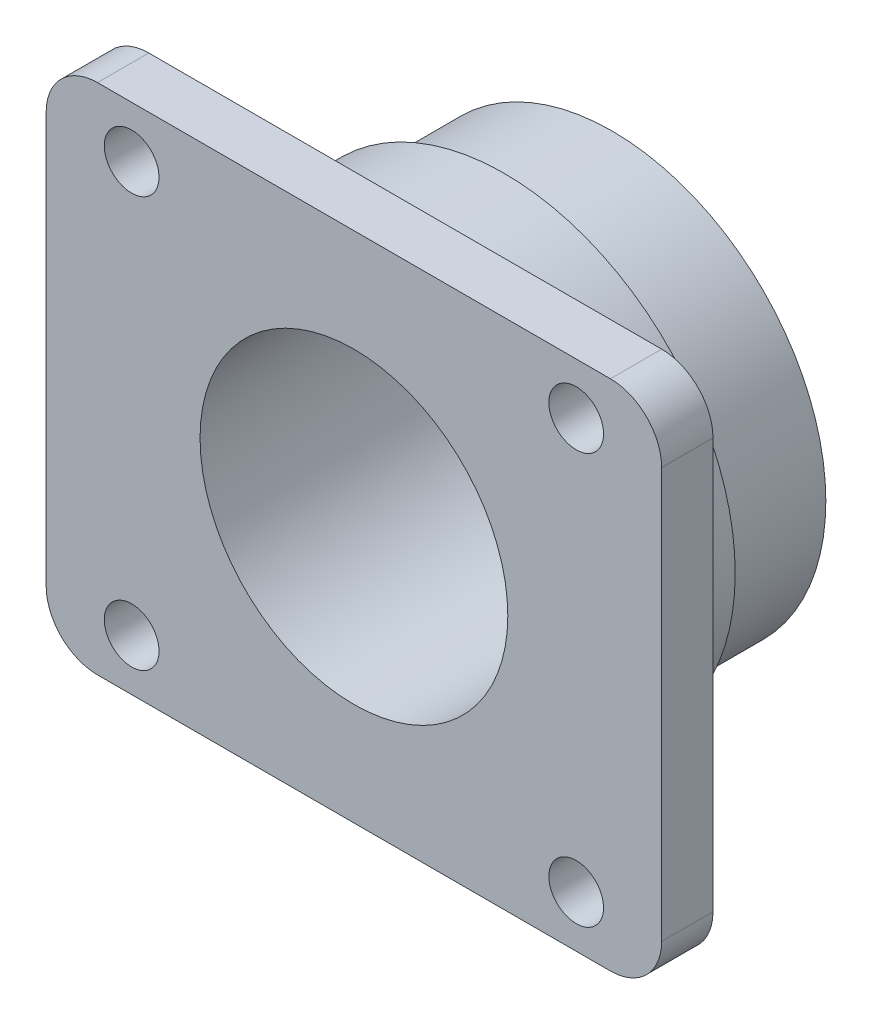
ISO-10303-21;
HEADER;
FILE_DESCRIPTION(('STEP AP214'),'2;1');
FILE_NAME('part.step','',(''),(''),'','','');
FILE_SCHEMA(('AUTOMOTIVE_DESIGN { 1 0 10303 214 1 1 1 1 }'));
ENDSEC;
DATA;
#1=APPLICATION_CONTEXT('core data for automotive mechanical design processes');
#2=APPLICATION_PROTOCOL_DEFINITION('international standard','automotive_design',2000,#1);
#3=PRODUCT_CONTEXT('',#1,'mechanical');
#4=PRODUCT('Part','Part','',(#3));
#5=PRODUCT_RELATED_PRODUCT_CATEGORY('part','',(#4));
#6=PRODUCT_DEFINITION_FORMATION('','',#4);
#7=PRODUCT_DEFINITION_CONTEXT('part definition',#1,'design');
#8=PRODUCT_DEFINITION('design','',#6,#7);
#9=PRODUCT_DEFINITION_SHAPE('','',#8);
#10=(LENGTH_UNIT() NAMED_UNIT(*) SI_UNIT(.MILLI.,.METRE.));
#11=(NAMED_UNIT(*) PLANE_ANGLE_UNIT() SI_UNIT($,.RADIAN.));
#12=(NAMED_UNIT(*) SI_UNIT($,.STERADIAN.) SOLID_ANGLE_UNIT());
#13=UNCERTAINTY_MEASURE_WITH_UNIT(LENGTH_MEASURE(1.E-05),#10,'distance_accuracy_value','');
#14=(GEOMETRIC_REPRESENTATION_CONTEXT(3) GLOBAL_UNCERTAINTY_ASSIGNED_CONTEXT((#13)) GLOBAL_UNIT_ASSIGNED_CONTEXT((#10,
#11,#12)) REPRESENTATION_CONTEXT('',''));
#15=CARTESIAN_POINT('',(0.,0.,0.));
#16=DIRECTION('',(0.,0.,1.));
#17=DIRECTION('',(1.,0.,0.));
#18=AXIS2_PLACEMENT_3D('',#15,#16,#17);
#19=CARTESIAN_POINT('',(0.,0.,0.));
#20=DIRECTION('',(0.,0.,1.));
#21=DIRECTION('',(1.,0.,0.));
#22=AXIS2_PLACEMENT_3D('',#19,#20,#21);
#23=PLANE('',#22);
#24=CARTESIAN_POINT('',(0.,0.,0.));
#25=DIRECTION('',(0.,0.,1.));
#26=DIRECTION('',(1.,0.,0.));
#27=AXIS2_PLACEMENT_3D('',#24,#25,#26);
#28=CIRCLE('',#27,12.5);
#29=CARTESIAN_POINT('',(12.5,0.,0.));
#30=VERTEX_POINT('',#29);
#31=EDGE_CURVE('E147',#30,#30,#28,.T.);
#32=ORIENTED_EDGE('',*,*,#31,.F.);
#33=EDGE_LOOP('',(#32));
#34=FACE_BOUND('',#33,.T.);
#35=CARTESIAN_POINT('',(0.,0.,0.));
#36=DIRECTION('',(0.,0.,1.));
#37=DIRECTION('',(1.,0.,0.));
#38=AXIS2_PLACEMENT_3D('',#35,#36,#37);
#39=CIRCLE('',#38,9.);
#40=CARTESIAN_POINT('',(9.,0.,0.));
#41=VERTEX_POINT('',#40);
#42=EDGE_CURVE('E145',#41,#41,#39,.T.);
#43=ORIENTED_EDGE('',*,*,#42,.T.);
#44=EDGE_LOOP('',(#43));
#45=FACE_BOUND('',#44,.T.);
#46=ADVANCED_FACE('F39',(#34,#45),#23,.F.);
#47=CARTESIAN_POINT('',(0.,0.,6.3));
#48=DIRECTION('',(0.,0.,-1.));
#49=DIRECTION('',(-1.,0.,0.));
#50=AXIS2_PLACEMENT_3D('',#47,#48,#49);
#51=CYLINDRICAL_SURFACE('',#50,12.5);
#52=CARTESIAN_POINT('',(0.,0.,6.3));
#53=DIRECTION('',(0.,0.,1.));
#54=DIRECTION('',(1.,0.,0.));
#55=AXIS2_PLACEMENT_3D('',#52,#53,#54);
#56=CIRCLE('',#55,12.5);
#57=CARTESIAN_POINT('',(12.5,0.,6.3));
#58=VERTEX_POINT('',#57);
#59=EDGE_CURVE('E151',#58,#58,#56,.T.);
#60=ORIENTED_EDGE('',*,*,#59,.F.);
#61=EDGE_LOOP('',(#60));
#62=FACE_BOUND('',#61,.T.);
#63=ORIENTED_EDGE('',*,*,#31,.T.);
#64=EDGE_LOOP('',(#63));
#65=FACE_BOUND('',#64,.T.);
#66=ADVANCED_FACE('F244',(#62,#65),#51,.T.);
#67=CARTESIAN_POINT('',(0.,0.,6.3));
#68=DIRECTION('',(0.,0.,-1.));
#69=DIRECTION('',(-1.,0.,0.));
#70=AXIS2_PLACEMENT_3D('',#67,#68,#69);
#71=CYLINDRICAL_SURFACE('',#70,9.);
#72=ORIENTED_EDGE('',*,*,#42,.F.);
#73=EDGE_LOOP('',(#72));
#74=FACE_BOUND('',#73,.T.);
#75=CARTESIAN_POINT('',(0.,0.,15.1));
#76=DIRECTION('',(0.,0.,1.));
#77=DIRECTION('',(1.,0.,0.));
#78=AXIS2_PLACEMENT_3D('',#75,#76,#77);
#79=CIRCLE('',#78,9.);
#80=CARTESIAN_POINT('',(9.,0.,15.1));
#81=VERTEX_POINT('',#80);
#82=EDGE_CURVE('E183',#81,#81,#79,.T.);
#83=ORIENTED_EDGE('',*,*,#82,.T.);
#84=EDGE_LOOP('',(#83));
#85=FACE_BOUND('',#84,.T.);
#86=ADVANCED_FACE('F246',(#74,#85),#71,.F.);
#87=CARTESIAN_POINT('',(0.,0.,6.3));
#88=DIRECTION('',(0.,0.,1.));
#89=DIRECTION('',(1.,0.,0.));
#90=AXIS2_PLACEMENT_3D('',#87,#88,#89);
#91=PLANE('',#90);
#92=ORIENTED_EDGE('',*,*,#59,.T.);
#93=EDGE_LOOP('',(#92));
#94=FACE_BOUND('',#93,.T.);
#95=CARTESIAN_POINT('',(0.,0.,6.3));
#96=DIRECTION('',(0.,0.,1.));
#97=DIRECTION('',(1.,0.,0.));
#98=AXIS2_PLACEMENT_3D('',#95,#96,#97);
#99=CIRCLE('',#98,13.5);
#100=CARTESIAN_POINT('',(13.5,0.,6.3));
#101=VERTEX_POINT('',#100);
#102=EDGE_CURVE('E144',#101,#101,#99,.T.);
#103=ORIENTED_EDGE('',*,*,#102,.F.);
#104=EDGE_LOOP('',(#103));
#105=FACE_BOUND('',#104,.T.);
#106=ADVANCED_FACE('F232',(#94,#105),#91,.F.);
#107=CARTESIAN_POINT('',(0.,0.,12.1));
#108=DIRECTION('',(0.,0.,-1.));
#109=DIRECTION('',(-1.,0.,0.));
#110=AXIS2_PLACEMENT_3D('',#107,#108,#109);
#111=CYLINDRICAL_SURFACE('',#110,13.5);
#112=CARTESIAN_POINT('',(0.,0.,12.1));
#113=DIRECTION('',(0.,0.,1.));
#114=DIRECTION('',(1.,0.,0.));
#115=AXIS2_PLACEMENT_3D('',#112,#113,#114);
#116=CIRCLE('',#115,13.5);
#117=CARTESIAN_POINT('',(13.5,0.,12.1));
#118=VERTEX_POINT('',#117);
#119=EDGE_CURVE('E143',#118,#118,#116,.T.);
#120=ORIENTED_EDGE('',*,*,#119,.F.);
#121=EDGE_LOOP('',(#120));
#122=FACE_BOUND('',#121,.T.);
#123=ORIENTED_EDGE('',*,*,#102,.T.);
#124=EDGE_LOOP('',(#123));
#125=FACE_BOUND('',#124,.T.);
#126=ADVANCED_FACE('F223',(#122,#125),#111,.T.);
#127=CARTESIAN_POINT('',(0.,0.,15.1));
#128=DIRECTION('',(0.,0.,1.));
#129=DIRECTION('',(1.,0.,0.));
#130=AXIS2_PLACEMENT_3D('',#127,#128,#129);
#131=PLANE('',#130);
#132=CARTESIAN_POINT('',(-13.,-12.,15.1));
#133=DIRECTION('',(0.,0.,1.));
#134=DIRECTION('',(1.,0.,0.));
#135=AXIS2_PLACEMENT_3D('',#132,#133,#134);
#136=CIRCLE('',#135,1.6);
#137=CARTESIAN_POINT('',(-11.4,-12.,15.1));
#138=VERTEX_POINT('',#137);
#139=EDGE_CURVE('E202',#138,#138,#136,.T.);
#140=ORIENTED_EDGE('',*,*,#139,.F.);
#141=EDGE_LOOP('',(#140));
#142=FACE_BOUND('',#141,.T.);
#143=CARTESIAN_POINT('',(13.,12.,15.1));
#144=DIRECTION('',(0.,0.,1.));
#145=DIRECTION('',(1.,0.,0.));
#146=AXIS2_PLACEMENT_3D('',#143,#144,#145);
#147=CIRCLE('',#146,1.6);
#148=CARTESIAN_POINT('',(14.6,12.,15.1));
#149=VERTEX_POINT('',#148);
#150=EDGE_CURVE('E187',#149,#149,#147,.T.);
#151=ORIENTED_EDGE('',*,*,#150,.F.);
#152=EDGE_LOOP('',(#151));
#153=FACE_BOUND('',#152,.T.);
#154=DIRECTION('',(1.,0.,0.));
#155=VECTOR('',#154,1.);
#156=CARTESIAN_POINT('',(-18.,-15.,15.1));
#157=LINE('',#156,#155);
#158=CARTESIAN_POINT('',(-15.,-15.,15.1));
#159=VERTEX_POINT('',#158);
#160=CARTESIAN_POINT('',(15.,-15.,15.1));
#161=VERTEX_POINT('',#160);
#162=EDGE_CURVE('E195',#159,#161,#157,.T.);
#163=ORIENTED_EDGE('',*,*,#162,.T.);
#164=CARTESIAN_POINT('',(15.,-12.,15.1));
#165=DIRECTION('',(0.,0.,1.));
#166=DIRECTION('',(1.,0.,0.));
#167=AXIS2_PLACEMENT_3D('',#164,#165,#166);
#168=CIRCLE('',#167,3.);
#169=CARTESIAN_POINT('',(18.,-12.,15.1));
#170=VERTEX_POINT('',#169);
#171=EDGE_CURVE('E166',#161,#170,#168,.T.);
#172=ORIENTED_EDGE('',*,*,#171,.T.);
#173=DIRECTION('',(0.,1.,0.));
#174=VECTOR('',#173,1.);
#175=CARTESIAN_POINT('',(18.,-15.,15.1));
#176=LINE('',#175,#174);
#177=CARTESIAN_POINT('',(18.,12.,15.1));
#178=VERTEX_POINT('',#177);
#179=EDGE_CURVE('E122',#170,#178,#176,.T.);
#180=ORIENTED_EDGE('',*,*,#179,.T.);
#181=CARTESIAN_POINT('',(15.,12.,15.1));
#182=DIRECTION('',(0.,0.,1.));
#183=DIRECTION('',(1.,0.,0.));
#184=AXIS2_PLACEMENT_3D('',#181,#182,#183);
#185=CIRCLE('',#184,3.);
#186=CARTESIAN_POINT('',(15.,15.,15.1));
#187=VERTEX_POINT('',#186);
#188=EDGE_CURVE('E163',#178,#187,#185,.T.);
#189=ORIENTED_EDGE('',*,*,#188,.T.);
#190=DIRECTION('',(-1.,0.,0.));
#191=VECTOR('',#190,1.);
#192=CARTESIAN_POINT('',(18.,15.,15.1));
#193=LINE('',#192,#191);
#194=CARTESIAN_POINT('',(-15.,15.,15.1));
#195=VERTEX_POINT('',#194);
#196=EDGE_CURVE('E134',#187,#195,#193,.T.);
#197=ORIENTED_EDGE('',*,*,#196,.T.);
#198=CARTESIAN_POINT('',(-15.,12.,15.1));
#199=DIRECTION('',(0.,0.,1.));
#200=DIRECTION('',(1.,0.,0.));
#201=AXIS2_PLACEMENT_3D('',#198,#199,#200);
#202=CIRCLE('',#201,3.);
#203=CARTESIAN_POINT('',(-18.,12.,15.1));
#204=VERTEX_POINT('',#203);
#205=EDGE_CURVE('E63',#195,#204,#202,.T.);
#206=ORIENTED_EDGE('',*,*,#205,.T.);
#207=DIRECTION('',(0.,-1.,0.));
#208=VECTOR('',#207,1.);
#209=CARTESIAN_POINT('',(-18.,15.,15.1));
#210=LINE('',#209,#208);
#211=CARTESIAN_POINT('',(-18.,-12.,15.1));
#212=VERTEX_POINT('',#211);
#213=EDGE_CURVE('E131',#204,#212,#210,.T.);
#214=ORIENTED_EDGE('',*,*,#213,.T.);
#215=CARTESIAN_POINT('',(-15.,-12.,15.1));
#216=DIRECTION('',(0.,0.,1.));
#217=DIRECTION('',(1.,0.,0.));
#218=AXIS2_PLACEMENT_3D('',#215,#216,#217);
#219=CIRCLE('',#218,3.);
#220=EDGE_CURVE('E170',#212,#159,#219,.T.);
#221=ORIENTED_EDGE('',*,*,#220,.T.);
#222=EDGE_LOOP('',(#163,#172,#180,#189,#197,#206,#214,#221));
#223=FACE_BOUND('',#222,.T.);
#224=ORIENTED_EDGE('',*,*,#82,.F.);
#225=EDGE_LOOP('',(#224));
#226=FACE_BOUND('',#225,.T.);
#227=CARTESIAN_POINT('',(13.,-12.,15.1));
#228=DIRECTION('',(0.,0.,1.));
#229=DIRECTION('',(-1.,0.,0.));
#230=AXIS2_PLACEMENT_3D('',#227,#228,#229);
#231=CIRCLE('',#230,1.6);
#232=CARTESIAN_POINT('',(11.4,-12.,15.1));
#233=VERTEX_POINT('',#232);
#234=EDGE_CURVE('E200',#233,#233,#231,.T.);
#235=ORIENTED_EDGE('',*,*,#234,.F.);
#236=EDGE_LOOP('',(#235));
#237=FACE_BOUND('',#236,.T.);
#238=CARTESIAN_POINT('',(-13.,12.,15.1));
#239=DIRECTION('',(0.,0.,1.));
#240=DIRECTION('',(-1.,0.,0.));
#241=AXIS2_PLACEMENT_3D('',#238,#239,#240);
#242=CIRCLE('',#241,1.6);
#243=CARTESIAN_POINT('',(-14.6,12.,15.1));
#244=VERTEX_POINT('',#243);
#245=EDGE_CURVE('E211',#244,#244,#242,.T.);
#246=ORIENTED_EDGE('',*,*,#245,.F.);
#247=EDGE_LOOP('',(#246));
#248=FACE_BOUND('',#247,.T.);
#249=ADVANCED_FACE('F224',(#142,#153,#223,#226,#237,#248),#131,.T.);
#250=CARTESIAN_POINT('',(0.,0.,12.1));
#251=DIRECTION('',(0.,0.,1.));
#252=DIRECTION('',(1.,0.,0.));
#253=AXIS2_PLACEMENT_3D('',#250,#251,#252);
#254=PLANE('',#253);
#255=ORIENTED_EDGE('',*,*,#119,.T.);
#256=EDGE_LOOP('',(#255));
#257=FACE_BOUND('',#256,.T.);
#258=DIRECTION('',(0.,1.,0.));
#259=VECTOR('',#258,1.);
#260=CARTESIAN_POINT('',(18.,-15.,12.1));
#261=LINE('',#260,#259);
#262=CARTESIAN_POINT('',(18.,-12.,12.1));
#263=VERTEX_POINT('',#262);
#264=CARTESIAN_POINT('',(18.,12.,12.1));
#265=VERTEX_POINT('',#264);
#266=EDGE_CURVE('E125',#263,#265,#261,.T.);
#267=ORIENTED_EDGE('',*,*,#266,.F.);
#268=CARTESIAN_POINT('',(15.,-12.,12.1));
#269=DIRECTION('',(0.,0.,1.));
#270=DIRECTION('',(1.,0.,0.));
#271=AXIS2_PLACEMENT_3D('',#268,#269,#270);
#272=CIRCLE('',#271,3.);
#273=CARTESIAN_POINT('',(15.,-15.,12.1));
#274=VERTEX_POINT('',#273);
#275=EDGE_CURVE('E104',#263,#274,#272,.F.);
#276=ORIENTED_EDGE('',*,*,#275,.T.);
#277=DIRECTION('',(1.,0.,0.));
#278=VECTOR('',#277,1.);
#279=CARTESIAN_POINT('',(-18.,-15.,12.1));
#280=LINE('',#279,#278);
#281=CARTESIAN_POINT('',(-15.,-15.,12.1));
#282=VERTEX_POINT('',#281);
#283=EDGE_CURVE('E132',#282,#274,#280,.T.);
#284=ORIENTED_EDGE('',*,*,#283,.F.);
#285=CARTESIAN_POINT('',(-15.,-12.,12.1));
#286=DIRECTION('',(0.,0.,1.));
#287=DIRECTION('',(1.,0.,0.));
#288=AXIS2_PLACEMENT_3D('',#285,#286,#287);
#289=CIRCLE('',#288,3.);
#290=CARTESIAN_POINT('',(-18.,-12.,12.1));
#291=VERTEX_POINT('',#290);
#292=EDGE_CURVE('E118',#282,#291,#289,.F.);
#293=ORIENTED_EDGE('',*,*,#292,.T.);
#294=DIRECTION('',(0.,-1.,0.));
#295=VECTOR('',#294,1.);
#296=CARTESIAN_POINT('',(-18.,15.,12.1));
#297=LINE('',#296,#295);
#298=CARTESIAN_POINT('',(-18.,12.,12.1));
#299=VERTEX_POINT('',#298);
#300=EDGE_CURVE('E140',#299,#291,#297,.T.);
#301=ORIENTED_EDGE('',*,*,#300,.F.);
#302=CARTESIAN_POINT('',(-15.,12.,12.1));
#303=DIRECTION('',(0.,0.,1.));
#304=DIRECTION('',(1.,0.,0.));
#305=AXIS2_PLACEMENT_3D('',#302,#303,#304);
#306=CIRCLE('',#305,3.);
#307=CARTESIAN_POINT('',(-15.,15.,12.1));
#308=VERTEX_POINT('',#307);
#309=EDGE_CURVE('E158',#299,#308,#306,.F.);
#310=ORIENTED_EDGE('',*,*,#309,.T.);
#311=DIRECTION('',(-1.,0.,0.));
#312=VECTOR('',#311,1.);
#313=CARTESIAN_POINT('',(18.,15.,12.1));
#314=LINE('',#313,#312);
#315=CARTESIAN_POINT('',(15.,15.,12.1));
#316=VERTEX_POINT('',#315);
#317=EDGE_CURVE('E177',#316,#308,#314,.T.);
#318=ORIENTED_EDGE('',*,*,#317,.F.);
#319=CARTESIAN_POINT('',(15.,12.,12.1));
#320=DIRECTION('',(0.,0.,1.));
#321=DIRECTION('',(1.,0.,0.));
#322=AXIS2_PLACEMENT_3D('',#319,#320,#321);
#323=CIRCLE('',#322,3.);
#324=EDGE_CURVE('E127',#316,#265,#323,.F.);
#325=ORIENTED_EDGE('',*,*,#324,.T.);
#326=EDGE_LOOP('',(#267,#276,#284,#293,#301,#310,#318,#325));
#327=FACE_BOUND('',#326,.T.);
#328=CARTESIAN_POINT('',(13.,12.,12.1));
#329=DIRECTION('',(0.,0.,1.));
#330=DIRECTION('',(1.,0.,0.));
#331=AXIS2_PLACEMENT_3D('',#328,#329,#330);
#332=CIRCLE('',#331,1.6);
#333=CARTESIAN_POINT('',(14.6,12.,12.1));
#334=VERTEX_POINT('',#333);
#335=EDGE_CURVE('E198',#334,#334,#332,.T.);
#336=ORIENTED_EDGE('',*,*,#335,.T.);
#337=EDGE_LOOP('',(#336));
#338=FACE_BOUND('',#337,.T.);
#339=CARTESIAN_POINT('',(13.,-12.,12.1));
#340=DIRECTION('',(0.,0.,1.));
#341=DIRECTION('',(-1.,0.,0.));
#342=AXIS2_PLACEMENT_3D('',#339,#340,#341);
#343=CIRCLE('',#342,1.6);
#344=CARTESIAN_POINT('',(11.4,-12.,12.1));
#345=VERTEX_POINT('',#344);
#346=EDGE_CURVE('E205',#345,#345,#343,.T.);
#347=ORIENTED_EDGE('',*,*,#346,.T.);
#348=EDGE_LOOP('',(#347));
#349=FACE_BOUND('',#348,.T.);
#350=CARTESIAN_POINT('',(-13.,-12.,12.1));
#351=DIRECTION('',(0.,0.,1.));
#352=DIRECTION('',(1.,0.,0.));
#353=AXIS2_PLACEMENT_3D('',#350,#351,#352);
#354=CIRCLE('',#353,1.6);
#355=CARTESIAN_POINT('',(-11.4,-12.,12.1));
#356=VERTEX_POINT('',#355);
#357=EDGE_CURVE('E208',#356,#356,#354,.T.);
#358=ORIENTED_EDGE('',*,*,#357,.T.);
#359=EDGE_LOOP('',(#358));
#360=FACE_BOUND('',#359,.T.);
#361=CARTESIAN_POINT('',(-13.,12.,12.1));
#362=DIRECTION('',(0.,0.,1.));
#363=DIRECTION('',(-1.,0.,0.));
#364=AXIS2_PLACEMENT_3D('',#361,#362,#363);
#365=CIRCLE('',#364,1.6);
#366=CARTESIAN_POINT('',(-14.6,12.,12.1));
#367=VERTEX_POINT('',#366);
#368=EDGE_CURVE('E212',#367,#367,#365,.T.);
#369=ORIENTED_EDGE('',*,*,#368,.T.);
#370=EDGE_LOOP('',(#369));
#371=FACE_BOUND('',#370,.T.);
#372=ADVANCED_FACE('F129',(#257,#327,#338,#349,#360,#371),#254,.F.);
#373=CARTESIAN_POINT('',(18.,15.,15.1));
#374=DIRECTION('',(0.,-1.,0.));
#375=DIRECTION('',(1.,0.,0.));
#376=AXIS2_PLACEMENT_3D('',#373,#374,#375);
#377=PLANE('',#376);
#378=ORIENTED_EDGE('',*,*,#317,.T.);
#379=DIRECTION('',(0.,0.,-1.));
#380=VECTOR('',#379,1.);
#381=CARTESIAN_POINT('',(-15.,15.,15.1));
#382=LINE('',#381,#380);
#383=EDGE_CURVE('E11',#308,#195,#382,.F.);
#384=ORIENTED_EDGE('',*,*,#383,.T.);
#385=ORIENTED_EDGE('',*,*,#196,.F.);
#386=DIRECTION('',(0.,0.,-1.));
#387=VECTOR('',#386,1.);
#388=CARTESIAN_POINT('',(15.,15.,15.1));
#389=LINE('',#388,#387);
#390=EDGE_CURVE('E50',#187,#316,#389,.T.);
#391=ORIENTED_EDGE('',*,*,#390,.T.);
#392=EDGE_LOOP('',(#378,#384,#385,#391));
#393=FACE_BOUND('',#392,.T.);
#394=ADVANCED_FACE('F179',(#393),#377,.F.);
#395=CARTESIAN_POINT('',(-18.,15.,15.1));
#396=DIRECTION('',(1.,0.,0.));
#397=DIRECTION('',(0.,1.,0.));
#398=AXIS2_PLACEMENT_3D('',#395,#396,#397);
#399=PLANE('',#398);
#400=ORIENTED_EDGE('',*,*,#300,.T.);
#401=DIRECTION('',(0.,0.,-1.));
#402=VECTOR('',#401,1.);
#403=CARTESIAN_POINT('',(-18.,-12.,15.1));
#404=LINE('',#403,#402);
#405=EDGE_CURVE('E53',#291,#212,#404,.F.);
#406=ORIENTED_EDGE('',*,*,#405,.T.);
#407=ORIENTED_EDGE('',*,*,#213,.F.);
#408=DIRECTION('',(0.,0.,-1.));
#409=VECTOR('',#408,1.);
#410=CARTESIAN_POINT('',(-18.,12.,15.1));
#411=LINE('',#410,#409);
#412=EDGE_CURVE('E173',#204,#299,#411,.T.);
#413=ORIENTED_EDGE('',*,*,#412,.T.);
#414=EDGE_LOOP('',(#400,#406,#407,#413));
#415=FACE_BOUND('',#414,.T.);
#416=ADVANCED_FACE('F270',(#415),#399,.F.);
#417=CARTESIAN_POINT('',(-18.,-15.,15.1));
#418=DIRECTION('',(0.,1.,0.));
#419=DIRECTION('',(0.,0.,1.));
#420=AXIS2_PLACEMENT_3D('',#417,#418,#419);
#421=PLANE('',#420);
#422=ORIENTED_EDGE('',*,*,#283,.T.);
#423=DIRECTION('',(0.,0.,-1.));
#424=VECTOR('',#423,1.);
#425=CARTESIAN_POINT('',(15.,-15.,15.1));
#426=LINE('',#425,#424);
#427=EDGE_CURVE('E109',#274,#161,#426,.F.);
#428=ORIENTED_EDGE('',*,*,#427,.T.);
#429=ORIENTED_EDGE('',*,*,#162,.F.);
#430=DIRECTION('',(0.,0.,-1.));
#431=VECTOR('',#430,1.);
#432=CARTESIAN_POINT('',(-15.,-15.,15.1));
#433=LINE('',#432,#431);
#434=EDGE_CURVE('E113',#159,#282,#433,.T.);
#435=ORIENTED_EDGE('',*,*,#434,.T.);
#436=EDGE_LOOP('',(#422,#428,#429,#435));
#437=FACE_BOUND('',#436,.T.);
#438=ADVANCED_FACE('F275',(#437),#421,.F.);
#439=CARTESIAN_POINT('',(18.,-15.,15.1));
#440=DIRECTION('',(-1.,0.,0.));
#441=DIRECTION('',(0.,0.,1.));
#442=AXIS2_PLACEMENT_3D('',#439,#440,#441);
#443=PLANE('',#442);
#444=ORIENTED_EDGE('',*,*,#179,.F.);
#445=DIRECTION('',(0.,0.,-1.));
#446=VECTOR('',#445,1.);
#447=CARTESIAN_POINT('',(18.,-12.,15.1));
#448=LINE('',#447,#446);
#449=EDGE_CURVE('E108',#170,#263,#448,.T.);
#450=ORIENTED_EDGE('',*,*,#449,.T.);
#451=ORIENTED_EDGE('',*,*,#266,.T.);
#452=DIRECTION('',(0.,0.,-1.));
#453=VECTOR('',#452,1.);
#454=CARTESIAN_POINT('',(18.,12.,15.1));
#455=LINE('',#454,#453);
#456=EDGE_CURVE('E130',#265,#178,#455,.F.);
#457=ORIENTED_EDGE('',*,*,#456,.T.);
#458=EDGE_LOOP('',(#444,#450,#451,#457));
#459=FACE_BOUND('',#458,.T.);
#460=ADVANCED_FACE('F123',(#459),#443,.F.);
#461=CARTESIAN_POINT('',(13.,12.,15.1));
#462=DIRECTION('',(0.,0.,-1.));
#463=DIRECTION('',(-1.,0.,0.));
#464=AXIS2_PLACEMENT_3D('',#461,#462,#463);
#465=CYLINDRICAL_SURFACE('',#464,1.6);
#466=ORIENTED_EDGE('',*,*,#150,.T.);
#467=EDGE_LOOP('',(#466));
#468=FACE_BOUND('',#467,.T.);
#469=ORIENTED_EDGE('',*,*,#335,.F.);
#470=EDGE_LOOP('',(#469));
#471=FACE_BOUND('',#470,.T.);
#472=ADVANCED_FACE('F284',(#468,#471),#465,.F.);
#473=CARTESIAN_POINT('',(13.,-12.,15.1));
#474=DIRECTION('',(0.,0.,-1.));
#475=DIRECTION('',(-1.,0.,0.));
#476=AXIS2_PLACEMENT_3D('',#473,#474,#475);
#477=CYLINDRICAL_SURFACE('',#476,1.6);
#478=ORIENTED_EDGE('',*,*,#234,.T.);
#479=EDGE_LOOP('',(#478));
#480=FACE_BOUND('',#479,.T.);
#481=ORIENTED_EDGE('',*,*,#346,.F.);
#482=EDGE_LOOP('',(#481));
#483=FACE_BOUND('',#482,.T.);
#484=ADVANCED_FACE('F279',(#480,#483),#477,.F.);
#485=CARTESIAN_POINT('',(-13.,-12.,15.1));
#486=DIRECTION('',(0.,0.,-1.));
#487=DIRECTION('',(-1.,0.,0.));
#488=AXIS2_PLACEMENT_3D('',#485,#486,#487);
#489=CYLINDRICAL_SURFACE('',#488,1.6);
#490=ORIENTED_EDGE('',*,*,#139,.T.);
#491=EDGE_LOOP('',(#490));
#492=FACE_BOUND('',#491,.T.);
#493=ORIENTED_EDGE('',*,*,#357,.F.);
#494=EDGE_LOOP('',(#493));
#495=FACE_BOUND('',#494,.T.);
#496=ADVANCED_FACE('F283',(#492,#495),#489,.F.);
#497=CARTESIAN_POINT('',(-13.,12.,15.1));
#498=DIRECTION('',(0.,0.,-1.));
#499=DIRECTION('',(-1.,0.,0.));
#500=AXIS2_PLACEMENT_3D('',#497,#498,#499);
#501=CYLINDRICAL_SURFACE('',#500,1.6);
#502=ORIENTED_EDGE('',*,*,#245,.T.);
#503=EDGE_LOOP('',(#502));
#504=FACE_BOUND('',#503,.T.);
#505=ORIENTED_EDGE('',*,*,#368,.F.);
#506=EDGE_LOOP('',(#505));
#507=FACE_BOUND('',#506,.T.);
#508=ADVANCED_FACE('F219',(#504,#507),#501,.F.);
#509=CARTESIAN_POINT('',(15.,-12.,15.1));
#510=DIRECTION('',(0.,0.,-1.));
#511=DIRECTION('',(-1.,0.,0.));
#512=AXIS2_PLACEMENT_3D('',#509,#510,#511);
#513=CYLINDRICAL_SURFACE('',#512,3.);
#514=ORIENTED_EDGE('',*,*,#171,.F.);
#515=ORIENTED_EDGE('',*,*,#427,.F.);
#516=ORIENTED_EDGE('',*,*,#275,.F.);
#517=ORIENTED_EDGE('',*,*,#449,.F.);
#518=EDGE_LOOP('',(#514,#515,#516,#517));
#519=FACE_BOUND('',#518,.T.);
#520=ADVANCED_FACE('F107',(#519),#513,.T.);
#521=CARTESIAN_POINT('',(-15.,-12.,15.1));
#522=DIRECTION('',(0.,0.,-1.));
#523=DIRECTION('',(-1.,0.,0.));
#524=AXIS2_PLACEMENT_3D('',#521,#522,#523);
#525=CYLINDRICAL_SURFACE('',#524,3.);
#526=ORIENTED_EDGE('',*,*,#220,.F.);
#527=ORIENTED_EDGE('',*,*,#405,.F.);
#528=ORIENTED_EDGE('',*,*,#292,.F.);
#529=ORIENTED_EDGE('',*,*,#434,.F.);
#530=EDGE_LOOP('',(#526,#527,#528,#529));
#531=FACE_BOUND('',#530,.T.);
#532=ADVANCED_FACE('F260',(#531),#525,.T.);
#533=CARTESIAN_POINT('',(-15.,12.,15.1));
#534=DIRECTION('',(0.,0.,-1.));
#535=DIRECTION('',(-1.,0.,0.));
#536=AXIS2_PLACEMENT_3D('',#533,#534,#535);
#537=CYLINDRICAL_SURFACE('',#536,3.);
#538=ORIENTED_EDGE('',*,*,#205,.F.);
#539=ORIENTED_EDGE('',*,*,#383,.F.);
#540=ORIENTED_EDGE('',*,*,#309,.F.);
#541=ORIENTED_EDGE('',*,*,#412,.F.);
#542=EDGE_LOOP('',(#538,#539,#540,#541));
#543=FACE_BOUND('',#542,.T.);
#544=ADVANCED_FACE('F259',(#543),#537,.T.);
#545=CARTESIAN_POINT('',(15.,12.,15.1));
#546=DIRECTION('',(0.,0.,-1.));
#547=DIRECTION('',(-1.,0.,0.));
#548=AXIS2_PLACEMENT_3D('',#545,#546,#547);
#549=CYLINDRICAL_SURFACE('',#548,3.);
#550=ORIENTED_EDGE('',*,*,#188,.F.);
#551=ORIENTED_EDGE('',*,*,#456,.F.);
#552=ORIENTED_EDGE('',*,*,#324,.F.);
#553=ORIENTED_EDGE('',*,*,#390,.F.);
#554=EDGE_LOOP('',(#550,#551,#552,#553));
#555=FACE_BOUND('',#554,.T.);
#556=ADVANCED_FACE('F41',(#555),#549,.T.);
#557=CLOSED_SHELL('',(#46,#66,#86,#106,#126,#249,#372,#394,#416,#438,#460,#472,#484,#496,#508,
#520,#532,#544,#556));
#558=MANIFOLD_SOLID_BREP('B2',#557);
#559=ADVANCED_BREP_SHAPE_REPRESENTATION('',(#18,#558),#14);
#560=SHAPE_DEFINITION_REPRESENTATION(#9,#559);
ENDSEC;
END-ISO-10303-21;
